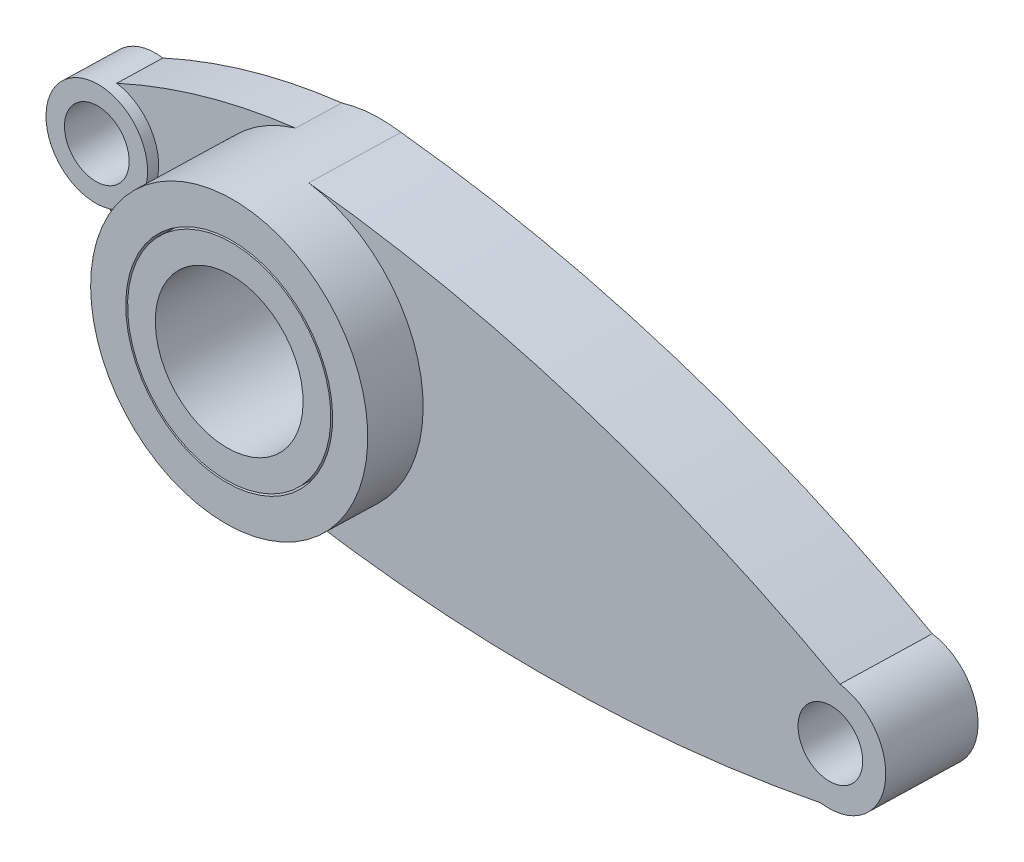
ISO-10303-21;
HEADER;
FILE_DESCRIPTION(('STEP AP214'),'2;1');
FILE_NAME('part.step','',(''),(''),'','','');
FILE_SCHEMA(('AUTOMOTIVE_DESIGN { 1 0 10303 214 1 1 1 1 }'));
ENDSEC;
DATA;
#1=APPLICATION_CONTEXT('core data for automotive mechanical design processes');
#2=APPLICATION_PROTOCOL_DEFINITION('international standard','automotive_design',2000,#1);
#3=PRODUCT_CONTEXT('',#1,'mechanical');
#4=PRODUCT('Part','Part','',(#3));
#5=PRODUCT_RELATED_PRODUCT_CATEGORY('part','',(#4));
#6=PRODUCT_DEFINITION_FORMATION('','',#4);
#7=PRODUCT_DEFINITION_CONTEXT('part definition',#1,'design');
#8=PRODUCT_DEFINITION('design','',#6,#7);
#9=PRODUCT_DEFINITION_SHAPE('','',#8);
#10=(LENGTH_UNIT() NAMED_UNIT(*) SI_UNIT(.MILLI.,.METRE.));
#11=(NAMED_UNIT(*) PLANE_ANGLE_UNIT() SI_UNIT($,.RADIAN.));
#12=(NAMED_UNIT(*) SI_UNIT($,.STERADIAN.) SOLID_ANGLE_UNIT());
#13=UNCERTAINTY_MEASURE_WITH_UNIT(LENGTH_MEASURE(1.E-05),#10,'distance_accuracy_value','');
#14=(GEOMETRIC_REPRESENTATION_CONTEXT(3) GLOBAL_UNCERTAINTY_ASSIGNED_CONTEXT((#13)) GLOBAL_UNIT_ASSIGNED_CONTEXT((#10,
#11,#12)) REPRESENTATION_CONTEXT('',''));
#15=CARTESIAN_POINT('',(0.,0.,0.));
#16=DIRECTION('',(0.,0.,1.));
#17=DIRECTION('',(1.,0.,0.));
#18=AXIS2_PLACEMENT_3D('',#15,#16,#17);
#19=CARTESIAN_POINT('',(51.1215092284812,-180.678580776699,19.727572992126));
#20=DIRECTION('',(0.,0.0265693446490875,0.999646972648303));
#21=DIRECTION('',(0.091674938297919,-0.995437445778039,0.0264574607807962));
#22=AXIS2_PLACEMENT_3D('',#19,#20,#21);
#23=PLANE('',#22);
#24=CARTESIAN_POINT('',(51.1215092284812,-180.678580776699,19.727572992126));
#25=DIRECTION('',(0.,0.0265693446490875,0.999646972648303));
#26=DIRECTION('',(0.091674938297919,-0.995437445778039,0.0264574607807962));
#27=AXIS2_PLACEMENT_3D('',#24,#25,#26);
#28=CIRCLE('',#27,11.);
#29=CARTESIAN_POINT('',(52.1299335497583,-191.628392680258,20.0186050607147));
#30=VERTEX_POINT('',#29);
#31=EDGE_CURVE('P0_E9',#30,#30,#28,.T.);
#32=ORIENTED_EDGE('',*,*,#31,.T.);
#33=EDGE_LOOP('',(#32));
#34=FACE_BOUND('',#33,.T.);
#35=CARTESIAN_POINT('',(51.1215092284812,-180.678580776699,19.727572992126));
#36=DIRECTION('',(0.,0.0265693446490875,0.999646972648303));
#37=DIRECTION('',(0.091674938297919,-0.995437445778039,0.0264574607807962));
#38=AXIS2_PLACEMENT_3D('',#35,#36,#37);
#39=CIRCLE('',#38,8.);
#40=CARTESIAN_POINT('',(51.8549087348646,-188.642080342924,19.9392326783723));
#41=VERTEX_POINT('',#40);
#42=EDGE_CURVE('P0_E25',#41,#41,#39,.T.);
#43=ORIENTED_EDGE('',*,*,#42,.F.);
#44=EDGE_LOOP('',(#43));
#45=FACE_BOUND('',#44,.T.);
#46=ADVANCED_FACE('P0_F14',(#34,#45),#23,.T.);
#47=CARTESIAN_POINT('',(51.1215092284812,-181.103690291085,3.73322142975311));
#48=DIRECTION('',(0.,0.0265693446490875,0.999646972648303));
#49=DIRECTION('',(0.091674938297919,-0.995437445778039,0.0264574607807962));
#50=AXIS2_PLACEMENT_3D('',#47,#48,#49);
#51=PLANE('',#50);
#52=CARTESIAN_POINT('',(51.1215092284812,-181.103690291085,3.73322142975311));
#53=DIRECTION('',(0.,0.0265693446490875,0.999646972648303));
#54=DIRECTION('',(0.091674938297919,-0.995437445778039,0.0264574607807962));
#55=AXIS2_PLACEMENT_3D('',#52,#53,#54);
#56=CIRCLE('',#55,11.);
#57=CARTESIAN_POINT('',(52.1299335497583,-192.053502194643,4.02425349834187));
#58=VERTEX_POINT('',#57);
#59=EDGE_CURVE('P0_E18',#58,#58,#56,.T.);
#60=ORIENTED_EDGE('',*,*,#59,.F.);
#61=EDGE_LOOP('',(#60));
#62=FACE_BOUND('',#61,.T.);
#63=CARTESIAN_POINT('',(51.1215092284812,-181.103690291085,3.73322142975311));
#64=DIRECTION('',(0.,0.0265693446490875,0.999646972648303));
#65=DIRECTION('',(0.091674938297919,-0.995437445778039,0.0264574607807962));
#66=AXIS2_PLACEMENT_3D('',#63,#64,#65);
#67=CIRCLE('',#66,8.);
#68=CARTESIAN_POINT('',(51.8549087348646,-189.067189857309,3.94488111599948));
#69=VERTEX_POINT('',#68);
#70=EDGE_CURVE('P0_E27',#69,#69,#67,.T.);
#71=ORIENTED_EDGE('',*,*,#70,.T.);
#72=EDGE_LOOP('',(#71));
#73=FACE_BOUND('',#72,.T.);
#74=ADVANCED_FACE('P0_F37',(#62,#73),#51,.F.);
#75=CARTESIAN_POINT('',(51.1215092284812,-180.678580776699,19.727572992126));
#76=DIRECTION('',(0.,-0.0265693446490875,-0.999646972648303));
#77=DIRECTION('',(-0.091674938297919,0.995437445778039,-0.0264574607807962));
#78=AXIS2_PLACEMENT_3D('',#75,#76,#77);
#79=CYLINDRICAL_SURFACE('',#78,11.);
#80=ORIENTED_EDGE('',*,*,#31,.F.);
#81=EDGE_LOOP('',(#80));
#82=FACE_BOUND('',#81,.T.);
#83=ORIENTED_EDGE('',*,*,#59,.T.);
#84=EDGE_LOOP('',(#83));
#85=FACE_BOUND('',#84,.T.);
#86=ADVANCED_FACE('P0_F16',(#82,#85),#79,.T.);
#87=CARTESIAN_POINT('',(51.1215092284812,-180.678580776699,19.727572992126));
#88=DIRECTION('',(0.,-0.0265693446490875,-0.999646972648303));
#89=DIRECTION('',(-0.091674938297919,0.995437445778039,-0.0264574607807962));
#90=AXIS2_PLACEMENT_3D('',#87,#88,#89);
#91=CYLINDRICAL_SURFACE('',#90,8.);
#92=ORIENTED_EDGE('',*,*,#42,.T.);
#93=EDGE_LOOP('',(#92));
#94=FACE_BOUND('',#93,.T.);
#95=ORIENTED_EDGE('',*,*,#70,.F.);
#96=EDGE_LOOP('',(#95));
#97=FACE_BOUND('',#96,.T.);
#98=ADVANCED_FACE('P0_F33',(#94,#97),#91,.F.);
#99=CLOSED_SHELL('',(#46,#74,#86,#98));
#100=MANIFOLD_SOLID_BREP('P0_B1',#99);
#101=CARTESIAN_POINT('',(51.1215092284812,-180.970843567839,8.73145629299463));
#102=DIRECTION('',(0.,-0.0265693446490876,-0.999646972648303));
#103=DIRECTION('',(-0.148077804805901,-0.988626578948365,0.0262764366061546));
#104=AXIS2_PLACEMENT_3D('',#101,#102,#103);
#105=PLANE('',#104);
#106=CARTESIAN_POINT('',(26.891604225051,-177.344218100219,8.63506520234079));
#107=DIRECTION('',(0.,0.0265693446490876,0.999646972648303));
#108=DIRECTION('',(0.148077804805901,0.988626578948365,-0.0262764366061546));
#109=AXIS2_PLACEMENT_3D('',#106,#107,#108);
#110=CIRCLE('',#109,5.5);
#111=CARTESIAN_POINT('',(26.0771762986186,-182.781664284435,8.77958560367464));
#112=VERTEX_POINT('',#111);
#113=CARTESIAN_POINT('',(27.7060321514835,-171.906771916003,8.49054480100694));
#114=VERTEX_POINT('',#113);
#115=EDGE_CURVE('P1_E98',#112,#114,#110,.T.);
#116=ORIENTED_EDGE('',*,*,#115,.F.);
#117=CARTESIAN_POINT('',(69.0380692364422,-134.020183431031,7.48356748343595));
#118=DIRECTION('',(0.,-0.0265693446490876,-0.999646972648303));
#119=DIRECTION('',(-0.148077804805901,-0.988626578948365,0.0262764366061546));
#120=AXIS2_PLACEMENT_3D('',#117,#118,#119);
#121=CIRCLE('',#120,65.);
#122=CARTESIAN_POINT('',(42.8981869402038,-193.511412670017,9.06476866394968));
#123=VERTEX_POINT('',#122);
#124=EDGE_CURVE('P1_E81',#112,#123,#121,.F.);
#125=ORIENTED_EDGE('',*,*,#124,.T.);
#126=CARTESIAN_POINT('',(51.1215092284812,-180.970843567839,8.73145629299463));
#127=DIRECTION('',(0.,-0.0265693446490876,-0.999646972648303));
#128=DIRECTION('',(-0.148077804805901,-0.988626578948365,0.0262764366061546));
#129=AXIS2_PLACEMENT_3D('',#126,#127,#128);
#130=CIRCLE('',#129,15.);
#131=CARTESIAN_POINT('',(46.9331263784612,-166.572545104165,8.34876783926149));
#132=VERTEX_POINT('',#131);
#133=EDGE_CURVE('P1_E103',#123,#132,#130,.T.);
#134=ORIENTED_EDGE('',*,*,#133,.T.);
#135=CARTESIAN_POINT('',(54.4960867992781,-231.108267407056,10.0640452271385));
#136=DIRECTION('',(0.,-0.0265693446490876,-0.999646972648303));
#137=DIRECTION('',(-0.148077804805901,-0.988626578948365,0.0262764366061546));
#138=AXIS2_PLACEMENT_3D('',#135,#136,#137);
#139=CIRCLE('',#138,65.);
#140=EDGE_CURVE('P1_E91',#114,#132,#139,.T.);
#141=ORIENTED_EDGE('',*,*,#140,.F.);
#142=EDGE_LOOP('',(#116,#125,#134,#141));
#143=FACE_BOUND('',#142,.T.);
#144=ADVANCED_FACE('P1_F17',(#143),#105,.F.);
#145=CARTESIAN_POINT('',(51.1215092284812,-180.678580776699,19.727572992126));
#146=DIRECTION('',(0.,0.0265693446490876,0.999646972648303));
#147=DIRECTION('',(0.148077804805901,0.988626578948365,-0.0262764366061546));
#148=AXIS2_PLACEMENT_3D('',#145,#146,#147);
#149=PLANE('',#148);
#150=CARTESIAN_POINT('',(51.1215092284812,-180.678580776699,19.727572992126));
#151=DIRECTION('',(0.,0.0265693446490876,0.999646972648303));
#152=DIRECTION('',(0.148077804805901,0.988626578948365,-0.0262764366061546));
#153=AXIS2_PLACEMENT_3D('',#150,#151,#152);
#154=CIRCLE('',#153,15.);
#155=CARTESIAN_POINT('',(53.3426763005697,-165.849182092474,19.3334264430336));
#156=VERTEX_POINT('',#155);
#157=EDGE_CURVE('P1_E11',#156,#156,#154,.T.);
#158=ORIENTED_EDGE('',*,*,#157,.T.);
#159=EDGE_LOOP('',(#158));
#160=FACE_BOUND('',#159,.T.);
#161=CARTESIAN_POINT('',(51.1215092284812,-180.678580776699,19.727572992126));
#162=DIRECTION('',(0.,0.0265693446490876,0.999646972648303));
#163=DIRECTION('',(0.148077804805901,0.988626578948365,-0.0262764366061546));
#164=AXIS2_PLACEMENT_3D('',#161,#162,#163);
#165=CIRCLE('',#164,11.2);
#166=CARTESIAN_POINT('',(49.4630378146551,-191.751198460921,20.0218690821149));
#167=VERTEX_POINT('',#166);
#168=EDGE_CURVE('P1_E162',#167,#167,#165,.T.);
#169=ORIENTED_EDGE('',*,*,#168,.F.);
#170=EDGE_LOOP('',(#169));
#171=FACE_BOUND('',#170,.T.);
#172=ADVANCED_FACE('P1_F187',(#160,#171),#149,.T.);
#173=CARTESIAN_POINT('',(51.1215092284812,-181.103690291085,3.73322142975311));
#174=DIRECTION('',(0.,0.0265693446490876,0.999646972648303));
#175=DIRECTION('',(0.148077804805901,0.988626578948365,-0.0262764366061546));
#176=AXIS2_PLACEMENT_3D('',#173,#174,#175);
#177=PLANE('',#176);
#178=CARTESIAN_POINT('',(51.1215092284812,-181.103690291085,3.73322142975311));
#179=DIRECTION('',(0.,0.0265693446490876,0.999646972648303));
#180=DIRECTION('',(0.148077804805901,0.988626578948365,-0.0262764366061546));
#181=AXIS2_PLACEMENT_3D('',#178,#179,#180);
#182=CIRCLE('',#181,15.);
#183=CARTESIAN_POINT('',(42.8981869402038,-193.644259393262,4.06653380070816));
#184=VERTEX_POINT('',#183);
#185=CARTESIAN_POINT('',(48.9003421563932,-195.93308897531,4.12736797884543));
#186=VERTEX_POINT('',#185);
#187=EDGE_CURVE('P1_E21',#184,#186,#182,.T.);
#188=ORIENTED_EDGE('',*,*,#187,.F.);
#189=CARTESIAN_POINT('',(69.0380692364422,-134.153030154276,2.48533262019443));
#190=DIRECTION('',(0.,-0.0265693446490876,-0.999646972648303));
#191=DIRECTION('',(-0.148077804805901,-0.988626578948365,0.0262764366061546));
#192=AXIS2_PLACEMENT_3D('',#189,#190,#191);
#193=CIRCLE('',#192,65.);
#194=CARTESIAN_POINT('',(26.0771762986186,-182.91451100768,3.78135074043312));
#195=VERTEX_POINT('',#194);
#196=EDGE_CURVE('P1_E142',#195,#184,#193,.F.);
#197=ORIENTED_EDGE('',*,*,#196,.F.);
#198=CARTESIAN_POINT('',(26.891604225051,-177.477064823464,3.63683033909927));
#199=DIRECTION('',(0.,-0.0265693446490876,-0.999646972648303));
#200=DIRECTION('',(-0.148077804805901,-0.988626578948365,0.0262764366061546));
#201=AXIS2_PLACEMENT_3D('',#198,#199,#200);
#202=CIRCLE('',#201,5.5);
#203=CARTESIAN_POINT('',(27.7060321514835,-172.039618639248,3.49230993776542));
#204=VERTEX_POINT('',#203);
#205=EDGE_CURVE('P1_E100',#204,#195,#202,.F.);
#206=ORIENTED_EDGE('',*,*,#205,.F.);
#207=CARTESIAN_POINT('',(54.4960867992781,-231.241114130301,5.06581036389696));
#208=DIRECTION('',(0.,-0.0265693446490876,-0.999646972648303));
#209=DIRECTION('',(-0.148077804805901,-0.988626578948365,0.0262764366061546));
#210=AXIS2_PLACEMENT_3D('',#207,#208,#209);
#211=CIRCLE('',#210,65.);
#212=CARTESIAN_POINT('',(46.9331263784612,-166.705391827411,3.35053297601998));
#213=VERTEX_POINT('',#212);
#214=EDGE_CURVE('P1_E151',#204,#213,#211,.T.);
#215=ORIENTED_EDGE('',*,*,#214,.T.);
#216=CARTESIAN_POINT('',(53.3426763005697,-166.274291606859,3.33907488066079));
#217=VERTEX_POINT('',#216);
#218=EDGE_CURVE('P1_E165',#217,#213,#182,.T.);
#219=ORIENTED_EDGE('',*,*,#218,.F.);
#220=CARTESIAN_POINT('',(36.2931920709823,-325.307145070554,7.56596578296669));
#221=DIRECTION('',(0.,-0.0265693446490876,-0.999646972648303));
#222=DIRECTION('',(-0.148077804805901,-0.988626578948365,0.0262764366061546));
#223=AXIS2_PLACEMENT_3D('',#220,#221,#222);
#224=CIRCLE('',#223,160.);
#225=CARTESIAN_POINT('',(111.34851892286,-184.053462574832,3.81162262396231));
#226=VERTEX_POINT('',#225);
#227=EDGE_CURVE('P1_E135',#217,#226,#224,.T.);
#228=ORIENTED_EDGE('',*,*,#227,.T.);
#229=CARTESIAN_POINT('',(110.460052094024,-189.985222048522,3.96928124359924));
#230=DIRECTION('',(0.,-0.0265693446490876,-0.999646972648303));
#231=DIRECTION('',(-0.148077804805901,-0.988626578948365,0.0262764366061546));
#232=AXIS2_PLACEMENT_3D('',#229,#230,#231);
#233=CIRCLE('',#232,6.);
#234=CARTESIAN_POINT('',(109.571585265189,-195.916981522212,4.12693986323617));
#235=VERTEX_POINT('',#234);
#236=EDGE_CURVE('P1_E111',#226,#235,#233,.T.);
#237=ORIENTED_EDGE('',*,*,#236,.T.);
#238=CARTESIAN_POINT('',(79.1942414638075,-38.8826012294414,-0.0468341649101115));
#239=DIRECTION('',(0.,-0.0265693446490876,-0.999646972648303));
#240=DIRECTION('',(-0.148077804805901,-0.988626578948365,0.0262764366061546));
#241=AXIS2_PLACEMENT_3D('',#238,#239,#240);
#242=CIRCLE('',#241,160.);
#243=EDGE_CURVE('P1_E132',#186,#235,#242,.F.);
#244=ORIENTED_EDGE('',*,*,#243,.F.);
#245=EDGE_LOOP('',(#188,#197,#206,#215,#219,#228,#237,#244));
#246=FACE_BOUND('',#245,.T.);
#247=CARTESIAN_POINT('',(51.1215092284812,-181.103690291085,3.73322142975311));
#248=DIRECTION('',(0.,0.0265693446490876,0.999646972648303));
#249=DIRECTION('',(0.148077804805901,0.988626578948365,-0.0262764366061546));
#250=AXIS2_PLACEMENT_3D('',#247,#248,#249);
#251=CIRCLE('',#250,11.2);
#252=CARTESIAN_POINT('',(49.4630378146551,-192.176307975306,4.02751751974204));
#253=VERTEX_POINT('',#252);
#254=EDGE_CURVE('P1_E157',#253,#253,#251,.T.);
#255=ORIENTED_EDGE('',*,*,#254,.T.);
#256=EDGE_LOOP('',(#255));
#257=FACE_BOUND('',#256,.T.);
#258=CARTESIAN_POINT('',(26.891604225051,-177.477064823464,3.63683033909927));
#259=DIRECTION('',(0.,-0.0265693446490876,-0.999646972648303));
#260=DIRECTION('',(-0.148077804805901,-0.988626578948365,0.0262764366061546));
#261=AXIS2_PLACEMENT_3D('',#258,#259,#260);
#262=CIRCLE('',#261,3.5);
#263=CARTESIAN_POINT('',(26.3733319082304,-180.937257849784,3.72879786722081));
#264=VERTEX_POINT('',#263);
#265=EDGE_CURVE('P1_E92',#264,#264,#262,.F.);
#266=ORIENTED_EDGE('',*,*,#265,.T.);
#267=EDGE_LOOP('',(#266));
#268=FACE_BOUND('',#267,.T.);
#269=CARTESIAN_POINT('',(110.460052094024,-189.985222048522,3.96928124359924));
#270=DIRECTION('',(0.,-0.0265693446490876,-0.999646972648303));
#271=DIRECTION('',(-0.148077804805901,-0.988626578948365,0.0262764366061546));
#272=AXIS2_PLACEMENT_3D('',#269,#270,#271);
#273=CIRCLE('',#272,3.5);
#274=CARTESIAN_POINT('',(109.941779777204,-193.445415074842,4.06124877172078));
#275=VERTEX_POINT('',#274);
#276=EDGE_CURVE('P1_E120',#275,#275,#273,.T.);
#277=ORIENTED_EDGE('',*,*,#276,.F.);
#278=EDGE_LOOP('',(#277));
#279=FACE_BOUND('',#278,.T.);
#280=ADVANCED_FACE('P1_F169',(#246,#257,#268,#279),#177,.F.);
#281=CARTESIAN_POINT('',(51.1215092284812,-180.678580776699,19.727572992126));
#282=DIRECTION('',(0.,-0.0265693446490876,-0.999646972648303));
#283=DIRECTION('',(-0.148077804805901,-0.988626578948365,0.0262764366061546));
#284=AXIS2_PLACEMENT_3D('',#281,#282,#283);
#285=CYLINDRICAL_SURFACE('',#284,15.);
#286=CARTESIAN_POINT('',(51.1215092284812,-180.837996844594,13.7296911562361));
#287=DIRECTION('',(0.,-0.0265693446490876,-0.999646972648303));
#288=DIRECTION('',(-0.148077804805901,-0.988626578948365,0.0262764366061546));
#289=AXIS2_PLACEMENT_3D('',#286,#287,#288);
#290=CIRCLE('',#289,15.);
#291=CARTESIAN_POINT('',(53.3426763005703,-166.008598160368,13.3355446071438));
#292=VERTEX_POINT('',#291);
#293=CARTESIAN_POINT('',(48.9003421563927,-195.667395528819,14.1238377053285));
#294=VERTEX_POINT('',#293);
#295=EDGE_CURVE('P1_E36',#292,#294,#290,.T.);
#296=ORIENTED_EDGE('',*,*,#295,.F.);
#297=DIRECTION('',(0.,-0.0265693446490876,-0.999646972648303));
#298=VECTOR('',#297,1.);
#299=CARTESIAN_POINT('',(53.3426763005697,-166.008598160368,13.3355446071438));
#300=LINE('',#299,#298);
#301=EDGE_CURVE('P1_E143',#292,#217,#300,.T.);
#302=ORIENTED_EDGE('',*,*,#301,.T.);
#303=ORIENTED_EDGE('',*,*,#218,.T.);
#304=DIRECTION('',(0.,-0.0265693446490876,-0.999646972648303));
#305=VECTOR('',#304,1.);
#306=CARTESIAN_POINT('',(46.9331263784612,-166.572545104165,8.34876783926149));
#307=LINE('',#306,#305);
#308=EDGE_CURVE('P1_E158',#132,#213,#307,.T.);
#309=ORIENTED_EDGE('',*,*,#308,.F.);
#310=ORIENTED_EDGE('',*,*,#133,.F.);
#311=DIRECTION('',(0.,-0.0265693446490876,-0.999646972648303));
#312=VECTOR('',#311,1.);
#313=CARTESIAN_POINT('',(42.8981869402038,-193.511412670017,9.06476866394968));
#314=LINE('',#313,#312);
#315=EDGE_CURVE('P1_E87',#123,#184,#314,.T.);
#316=ORIENTED_EDGE('',*,*,#315,.T.);
#317=ORIENTED_EDGE('',*,*,#187,.T.);
#318=DIRECTION('',(0.,-0.0265693446490876,-0.999646972648303));
#319=VECTOR('',#318,1.);
#320=CARTESIAN_POINT('',(48.9003421563927,-195.667395528819,14.1238377053285));
#321=LINE('',#320,#319);
#322=EDGE_CURVE('P1_E32',#294,#186,#321,.T.);
#323=ORIENTED_EDGE('',*,*,#322,.F.);
#324=EDGE_LOOP('',(#296,#302,#303,#309,#310,#316,#317,#323));
#325=FACE_BOUND('',#324,.T.);
#326=ORIENTED_EDGE('',*,*,#157,.F.);
#327=EDGE_LOOP('',(#326));
#328=FACE_BOUND('',#327,.T.);
#329=ADVANCED_FACE('P1_F19',(#325,#328),#285,.T.);
#330=CARTESIAN_POINT('',(51.1215092284812,-180.678580776699,19.727572992126));
#331=DIRECTION('',(0.,-0.0265693446490876,-0.999646972648303));
#332=DIRECTION('',(-0.148077804805901,-0.988626578948365,0.0262764366061546));
#333=AXIS2_PLACEMENT_3D('',#330,#331,#332);
#334=CYLINDRICAL_SURFACE('',#333,11.2);
#335=CARTESIAN_POINT('',(49.4630378146551,-191.751198460921,20.0218690821149));
#336=CARTESIAN_POINT('',(49.4630378146551,-191.755626685029,19.8552612533402));
#337=CARTESIAN_POINT('',(49.4630378146551,-191.760054909137,19.6886534245655));
#338=CARTESIAN_POINT('',(49.4630378146551,-191.768911357354,19.355437767016));
#339=CARTESIAN_POINT('',(49.4630378146551,-191.773339581462,19.1888299382413));
#340=CARTESIAN_POINT('',(49.4630378146551,-191.782196029678,18.8556142806919));
#341=CARTESIAN_POINT('',(49.4630378146551,-191.786624253786,18.6890064519172));
#342=CARTESIAN_POINT('',(49.4630378146551,-191.795480702003,18.3557907943677));
#343=CARTESIAN_POINT('',(49.4630378146551,-191.799908926111,18.189182965593));
#344=CARTESIAN_POINT('',(49.4630378146551,-191.808765374327,17.8559673080436));
#345=CARTESIAN_POINT('',(49.4630378146551,-191.813193598436,17.6893594792689));
#346=CARTESIAN_POINT('',(49.4630378146551,-191.822050046652,17.3561438217194));
#347=CARTESIAN_POINT('',(49.4630378146551,-191.82647827076,17.1895359929447));
#348=CARTESIAN_POINT('',(49.4630378146551,-191.835334718976,16.8563203353953));
#349=CARTESIAN_POINT('',(49.4630378146551,-191.839762943085,16.6897125066205));
#350=CARTESIAN_POINT('',(49.4630378146551,-191.848619391301,16.3564968490711));
#351=CARTESIAN_POINT('',(49.4630378146551,-191.853047615409,16.1898890202964));
#352=CARTESIAN_POINT('',(49.4630378146551,-191.861904063626,15.856673362747));
#353=CARTESIAN_POINT('',(49.4630378146551,-191.866332287734,15.6900655339722));
#354=CARTESIAN_POINT('',(49.4630378146551,-191.87518873595,15.3568498764228));
#355=CARTESIAN_POINT('',(49.4630378146551,-191.879616960058,15.1902420476481));
#356=CARTESIAN_POINT('',(49.4630378146551,-191.888473408275,14.8570263900987));
#357=CARTESIAN_POINT('',(49.4630378146551,-191.892901632383,14.6904185613239));
#358=CARTESIAN_POINT('',(49.4630378146551,-191.901758080599,14.3572029037745));
#359=CARTESIAN_POINT('',(49.4630378146551,-191.906186304707,14.1905950749998));
#360=CARTESIAN_POINT('',(49.4630378146551,-191.915042752924,13.8573794174504));
#361=CARTESIAN_POINT('',(49.4630378146551,-191.919470977032,13.6907715886756));
#362=CARTESIAN_POINT('',(49.4630378146551,-191.928327425248,13.3575559311262));
#363=CARTESIAN_POINT('',(49.4630378146551,-191.932755649356,13.1909481023515));
#364=CARTESIAN_POINT('',(49.4630378146551,-191.941612097573,12.8577324448021));
#365=CARTESIAN_POINT('',(49.4630378146551,-191.946040321681,12.6911246160273));
#366=CARTESIAN_POINT('',(49.4630378146551,-191.954896769897,12.3579089584779));
#367=CARTESIAN_POINT('',(49.4630378146551,-191.959324994005,12.1913011297032));
#368=CARTESIAN_POINT('',(49.4630378146551,-191.968181442222,11.8580854721538));
#369=CARTESIAN_POINT('',(49.4630378146551,-191.97260966633,11.691477643379));
#370=CARTESIAN_POINT('',(49.4630378146551,-191.981466114546,11.3582619858296));
#371=CARTESIAN_POINT('',(49.4630378146551,-191.985894338655,11.1916541570549));
#372=CARTESIAN_POINT('',(49.4630378146551,-191.994750786871,10.8584384995054));
#373=CARTESIAN_POINT('',(49.4630378146551,-191.999179010979,10.6918306707307));
#374=CARTESIAN_POINT('',(49.4630378146551,-192.008035459195,10.3586150131813));
#375=CARTESIAN_POINT('',(49.4630378146551,-192.012463683304,10.1920071844066));
#376=CARTESIAN_POINT('',(49.4630378146551,-192.02132013152,9.85879152685715));
#377=CARTESIAN_POINT('',(49.4630378146551,-192.025748355628,9.69218369808243));
#378=CARTESIAN_POINT('',(49.4630378146551,-192.034604803845,9.358968040533));
#379=CARTESIAN_POINT('',(49.4630378146551,-192.039033027953,9.19236021175828));
#380=CARTESIAN_POINT('',(49.4630378146551,-192.047889476169,8.85914455420884));
#381=CARTESIAN_POINT('',(49.4630378146551,-192.052317700277,8.69253672543413));
#382=CARTESIAN_POINT('',(49.4630378146551,-192.061174148494,8.35932106788469));
#383=CARTESIAN_POINT('',(49.4630378146551,-192.065602372602,8.19271323910997));
#384=CARTESIAN_POINT('',(49.4630378146551,-192.074458820818,7.85949758156054));
#385=CARTESIAN_POINT('',(49.4630378146551,-192.078887044926,7.69288975278582));
#386=CARTESIAN_POINT('',(49.4630378146551,-192.087743493143,7.35967409523639));
#387=CARTESIAN_POINT('',(49.4630378146551,-192.092171717251,7.19306626646167));
#388=CARTESIAN_POINT('',(49.4630378146551,-192.101028165467,6.85985060891224));
#389=CARTESIAN_POINT('',(49.4630378146551,-192.105456389575,6.69324278013752));
#390=CARTESIAN_POINT('',(49.4630378146551,-192.114312837792,6.36002712258809));
#391=CARTESIAN_POINT('',(49.4630378146551,-192.1187410619,6.19341929381337));
#392=CARTESIAN_POINT('',(49.4630378146551,-192.127597510116,5.86020363626393));
#393=CARTESIAN_POINT('',(49.4630378146551,-192.132025734225,5.69359580748922));
#394=CARTESIAN_POINT('',(49.4630378146551,-192.140882182441,5.36038014993978));
#395=CARTESIAN_POINT('',(49.4630378146551,-192.145310406549,5.19377232116507));
#396=CARTESIAN_POINT('',(49.4630378146551,-192.154166854765,4.86055666361563));
#397=CARTESIAN_POINT('',(49.4630378146551,-192.158595078874,4.69394883484091));
#398=CARTESIAN_POINT('',(49.4630378146551,-192.16745152709,4.36073317729148));
#399=CARTESIAN_POINT('',(49.4630378146551,-192.171879751198,4.19412534851676));
#400=CARTESIAN_POINT('',(49.4630378146551,-192.176307975306,4.02751751974204));
#401=B_SPLINE_CURVE_WITH_KNOTS('',3,(#335,#336,#337,#338,#339,#340,#341,#342,#343,#344,#345,
#346,#347,#348,#349,#350,#351,#352,#353,#354,#355,#356,#357,#358,#359,#360,#361,#362,#363,#364,
#365,#366,#367,#368,#369,#370,#371,#372,#373,#374,#375,#376,#377,#378,#379,#380,#381,#382,#383,
#384,#385,#386,#387,#388,#389,#390,#391,#392,#393,#394,#395,#396,#397,#398,#399,#400),
.UNSPECIFIED.,.F.,.F.,(4,2,2,2,2,2,2,2,2,2,2,2,2,2,2,2,2,2,2,2,2,2,2,2,2,2,2,2,2,2,2,2,4),(0.,
0.499999999999999,0.999999999999999,1.5,2.,2.5,3.,3.5,4.,4.5,5.,5.5,5.99999999999999,6.5,
6.99999999999999,7.5,7.99999999999999,8.49999999999999,8.99999999999999,9.49999999999999,
9.99999999999999,10.5,11.,11.5,12.,12.5,13.,13.5,14.,14.5,15.,15.5,16.),.UNSPECIFIED.);
#402=EDGE_CURVE('P1_BSEAM172',#167,#253,#401,.T.);
#403=ORIENTED_EDGE('',*,*,#168,.T.);
#404=ORIENTED_EDGE('',*,*,#254,.F.);
#405=ORIENTED_EDGE('',*,*,#402,.T.);
#406=ORIENTED_EDGE('',*,*,#402,.F.);
#407=EDGE_LOOP('',(#403,#405,#404,#406));
#408=FACE_BOUND('',#407,.T.);
#409=ADVANCED_FACE('P1_F172',(#408),#334,.F.);
#410=CARTESIAN_POINT('',(26.891604225051,-177.344218100219,8.63506520234079));
#411=DIRECTION('',(0.,-0.0265693446490876,-0.999646972648303));
#412=DIRECTION('',(-0.148077804805901,-0.988626578948365,0.0262764366061546));
#413=AXIS2_PLACEMENT_3D('',#410,#411,#412);
#414=CYLINDRICAL_SURFACE('',#413,3.5);
#415=CARTESIAN_POINT('',(26.891604225051,-177.31233488664,9.83464156951875));
#416=DIRECTION('',(0.,0.0265693446490876,0.999646972648303));
#417=DIRECTION('',(0.148077804805901,0.988626578948365,-0.0262764366061546));
#418=AXIS2_PLACEMENT_3D('',#415,#416,#417);
#419=CIRCLE('',#418,3.5);
#420=CARTESIAN_POINT('',(26.3733319082304,-180.772527912959,9.92660909764029));
#421=VERTEX_POINT('',#420);
#422=EDGE_CURVE('P1_E108',#421,#421,#419,.T.);
#423=CARTESIAN_POINT('',(26.3733319082304,-180.937257849784,3.72879786722081));
#424=CARTESIAN_POINT('',(26.3733319082304,-180.935541912942,3.79335840087102));
#425=CARTESIAN_POINT('',(26.3733319082304,-180.9338259761,3.85791893452122));
#426=CARTESIAN_POINT('',(26.3733319082304,-180.930394102416,3.98704000182163));
#427=CARTESIAN_POINT('',(26.3733319082304,-180.928678165574,4.05160053547183));
#428=CARTESIAN_POINT('',(26.3733319082304,-180.92524629189,4.18072160277223));
#429=CARTESIAN_POINT('',(26.3733319082304,-180.923530355048,4.24528213642244));
#430=CARTESIAN_POINT('',(26.3733319082304,-180.920098481364,4.37440320372284));
#431=CARTESIAN_POINT('',(26.3733319082304,-180.918382544523,4.43896373737305));
#432=CARTESIAN_POINT('',(26.3733319082304,-180.914950670839,4.56808480467345));
#433=CARTESIAN_POINT('',(26.3733319082304,-180.913234733997,4.63264533832366));
#434=CARTESIAN_POINT('',(26.3733319082304,-180.909802860313,4.76176640562406));
#435=CARTESIAN_POINT('',(26.3733319082304,-180.908086923471,4.82632693927426));
#436=CARTESIAN_POINT('',(26.3733319082304,-180.904655049787,4.95544800657467));
#437=CARTESIAN_POINT('',(26.3733319082304,-180.902939112945,5.02000854022487));
#438=CARTESIAN_POINT('',(26.3733319082304,-180.899507239261,5.14912960752528));
#439=CARTESIAN_POINT('',(26.3733319082304,-180.89779130242,5.21369014117548));
#440=CARTESIAN_POINT('',(26.3733319082304,-180.894359428736,5.34281120847589));
#441=CARTESIAN_POINT('',(26.3733319082304,-180.892643491894,5.40737174212609));
#442=CARTESIAN_POINT('',(26.3733319082304,-180.88921161821,5.5364928094265));
#443=CARTESIAN_POINT('',(26.3733319082304,-180.887495681368,5.6010533430767));
#444=CARTESIAN_POINT('',(26.3733319082304,-180.884063807684,5.7301744103771));
#445=CARTESIAN_POINT('',(26.3733319082304,-180.882347870842,5.79473494402731));
#446=CARTESIAN_POINT('',(26.3733319082304,-180.878915997158,5.92385601132771));
#447=CARTESIAN_POINT('',(26.3733319082304,-180.877200060316,5.98841654497792));
#448=CARTESIAN_POINT('',(26.3733319082304,-180.873768186633,6.11753761227832));
#449=CARTESIAN_POINT('',(26.3733319082304,-180.872052249791,6.18209814592853));
#450=CARTESIAN_POINT('',(26.3733319082304,-180.868620376107,6.31121921322893));
#451=CARTESIAN_POINT('',(26.3733319082304,-180.866904439265,6.37577974687913));
#452=CARTESIAN_POINT('',(26.3733319082304,-180.863472565581,6.50490081417954));
#453=CARTESIAN_POINT('',(26.3733319082304,-180.861756628739,6.56946134782974));
#454=CARTESIAN_POINT('',(26.3733319082304,-180.858324755055,6.69858241513015));
#455=CARTESIAN_POINT('',(26.3733319082304,-180.856608818213,6.76314294878035));
#456=CARTESIAN_POINT('',(26.3733319082304,-180.85317694453,6.89226401608076));
#457=CARTESIAN_POINT('',(26.3733319082304,-180.851461007688,6.95682454973096));
#458=CARTESIAN_POINT('',(26.3733319082304,-180.848029134004,7.08594561703137));
#459=CARTESIAN_POINT('',(26.3733319082304,-180.846313197162,7.15050615068157));
#460=CARTESIAN_POINT('',(26.3733319082304,-180.842881323478,7.27962721798198));
#461=CARTESIAN_POINT('',(26.3733319082304,-180.841165386636,7.34418775163218));
#462=CARTESIAN_POINT('',(26.3733319082304,-180.837733512952,7.47330881893258));
#463=CARTESIAN_POINT('',(26.3733319082304,-180.83601757611,7.53786935258279));
#464=CARTESIAN_POINT('',(26.3733319082304,-180.832585702427,7.66699041988319));
#465=CARTESIAN_POINT('',(26.3733319082304,-180.830869765585,7.73155095353339));
#466=CARTESIAN_POINT('',(26.3733319082304,-180.827437891901,7.8606720208338));
#467=CARTESIAN_POINT('',(26.3733319082304,-180.825721955059,7.925232554484));
#468=CARTESIAN_POINT('',(26.3733319082304,-180.822290081375,8.05435362178441));
#469=CARTESIAN_POINT('',(26.3733319082304,-180.820574144533,8.11891415543461));
#470=CARTESIAN_POINT('',(26.3733319082304,-180.817142270849,8.24803522273502));
#471=CARTESIAN_POINT('',(26.3733319082304,-180.815426334007,8.31259575638522));
#472=CARTESIAN_POINT('',(26.3733319082304,-180.811994460323,8.44171682368563));
#473=CARTESIAN_POINT('',(26.3733319082304,-180.810278523482,8.50627735733583));
#474=CARTESIAN_POINT('',(26.3733319082304,-180.806846649798,8.63539842463624));
#475=CARTESIAN_POINT('',(26.3733319082304,-180.805130712956,8.69995895828644));
#476=CARTESIAN_POINT('',(26.3733319082304,-180.801698839272,8.82908002558684));
#477=CARTESIAN_POINT('',(26.3733319082304,-180.79998290243,8.89364055923705));
#478=CARTESIAN_POINT('',(26.3733319082304,-180.796551028746,9.02276162653745));
#479=CARTESIAN_POINT('',(26.3733319082304,-180.794835091904,9.08732216018766));
#480=CARTESIAN_POINT('',(26.3733319082304,-180.79140321822,9.21644322748806));
#481=CARTESIAN_POINT('',(26.3733319082304,-180.789687281379,9.28100376113827));
#482=CARTESIAN_POINT('',(26.3733319082304,-180.786255407695,9.41012482843867));
#483=CARTESIAN_POINT('',(26.3733319082304,-180.784539470853,9.47468536208887));
#484=CARTESIAN_POINT('',(26.3733319082304,-180.781107597169,9.60380642938928));
#485=CARTESIAN_POINT('',(26.3733319082304,-180.779391660327,9.66836696303948));
#486=CARTESIAN_POINT('',(26.3733319082304,-180.775959786643,9.79748803033989));
#487=CARTESIAN_POINT('',(26.3733319082304,-180.774243849801,9.86204856399009));
#488=CARTESIAN_POINT('',(26.3733319082304,-180.772527912959,9.92660909764029));
#489=B_SPLINE_CURVE_WITH_KNOTS('',3,(#423,#424,#425,#426,#427,#428,#429,#430,#431,#432,#433,
#434,#435,#436,#437,#438,#439,#440,#441,#442,#443,#444,#445,#446,#447,#448,#449,#450,#451,#452,
#453,#454,#455,#456,#457,#458,#459,#460,#461,#462,#463,#464,#465,#466,#467,#468,#469,#470,#471,
#472,#473,#474,#475,#476,#477,#478,#479,#480,#481,#482,#483,#484,#485,#486,#487,#488),
.UNSPECIFIED.,.F.,.F.,(4,2,2,2,2,2,2,2,2,2,2,2,2,2,2,2,2,2,2,2,2,2,2,2,2,2,2,2,2,2,2,2,4),(0.,
0.19375,0.387499999999999,0.581249999999999,0.775,0.968749999999999,1.1625,1.35625,1.55,1.74375,
1.9375,2.13125,2.325,2.51875,2.7125,2.90625,3.1,3.29375,3.4875,3.68125,3.875,4.06875,4.2625,
4.45625,4.65,4.84375,5.0375,5.23125,5.425,5.61875,5.8125,6.00625,6.2),.UNSPECIFIED.);
#490=EDGE_CURVE('P1_BSEAM174',#264,#421,#489,.T.);
#491=ORIENTED_EDGE('',*,*,#265,.F.);
#492=ORIENTED_EDGE('',*,*,#422,.T.);
#493=ORIENTED_EDGE('',*,*,#490,.T.);
#494=ORIENTED_EDGE('',*,*,#490,.F.);
#495=EDGE_LOOP('',(#491,#493,#492,#494));
#496=FACE_BOUND('',#495,.T.);
#497=ADVANCED_FACE('P1_F174',(#496),#414,.F.);
#498=CARTESIAN_POINT('',(26.891604225051,-177.344218100219,8.63506520234079));
#499=DIRECTION('',(0.,-0.0265693446490876,-0.999646972648303));
#500=DIRECTION('',(-0.148077804805901,-0.988626578948365,0.0262764366061546));
#501=AXIS2_PLACEMENT_3D('',#498,#499,#500);
#502=CYLINDRICAL_SURFACE('',#501,5.5);
#503=ORIENTED_EDGE('',*,*,#205,.T.);
#504=DIRECTION('',(0.,-0.0265693446490876,-0.999646972648303));
#505=VECTOR('',#504,1.);
#506=CARTESIAN_POINT('',(26.0771762986186,-182.781664284435,8.77958560367464));
#507=LINE('',#506,#505);
#508=EDGE_CURVE('P1_E85',#112,#195,#507,.T.);
#509=ORIENTED_EDGE('',*,*,#508,.F.);
#510=ORIENTED_EDGE('',*,*,#115,.T.);
#511=DIRECTION('',(0.,-0.0265693446490876,-0.999646972648303));
#512=VECTOR('',#511,1.);
#513=CARTESIAN_POINT('',(27.7060321514835,-171.906771916003,8.49054480100694));
#514=LINE('',#513,#512);
#515=EDGE_CURVE('P1_E102',#114,#204,#514,.T.);
#516=ORIENTED_EDGE('',*,*,#515,.T.);
#517=EDGE_LOOP('',(#503,#509,#510,#516));
#518=FACE_BOUND('',#517,.T.);
#519=CARTESIAN_POINT('',(26.891604225051,-177.31233488664,9.83464156951875));
#520=DIRECTION('',(0.,0.0265693446490876,0.999646972648303));
#521=DIRECTION('',(0.148077804805901,0.988626578948365,-0.0262764366061546));
#522=AXIS2_PLACEMENT_3D('',#519,#520,#521);
#523=CIRCLE('',#522,5.5);
#524=CARTESIAN_POINT('',(27.7060321514835,-171.874888702424,9.6901211681849));
#525=VERTEX_POINT('',#524);
#526=EDGE_CURVE('P1_E107',#525,#525,#523,.T.);
#527=ORIENTED_EDGE('',*,*,#526,.F.);
#528=EDGE_LOOP('',(#527));
#529=FACE_BOUND('',#528,.T.);
#530=ADVANCED_FACE('P1_F96',(#518,#529),#502,.T.);
#531=CARTESIAN_POINT('',(54.4960867992781,-231.108267407056,10.0640452271385));
#532=DIRECTION('',(0.,-0.0265693446490876,-0.999646972648303));
#533=DIRECTION('',(-0.148077804805901,-0.988626578948365,0.0262764366061546));
#534=AXIS2_PLACEMENT_3D('',#531,#532,#533);
#535=CYLINDRICAL_SURFACE('',#534,65.);
#536=ORIENTED_EDGE('',*,*,#214,.F.);
#537=ORIENTED_EDGE('',*,*,#515,.F.);
#538=ORIENTED_EDGE('',*,*,#140,.T.);
#539=ORIENTED_EDGE('',*,*,#308,.T.);
#540=EDGE_LOOP('',(#536,#537,#538,#539));
#541=FACE_BOUND('',#540,.T.);
#542=ADVANCED_FACE('P1_F197',(#541),#535,.T.);
#543=CARTESIAN_POINT('',(69.0380692364422,-134.020183431031,7.48356748343595));
#544=DIRECTION('',(0.,-0.0265693446490876,-0.999646972648303));
#545=DIRECTION('',(-0.148077804805901,-0.988626578948365,0.0262764366061546));
#546=AXIS2_PLACEMENT_3D('',#543,#544,#545);
#547=CYLINDRICAL_SURFACE('',#546,65.);
#548=ORIENTED_EDGE('',*,*,#196,.T.);
#549=ORIENTED_EDGE('',*,*,#315,.F.);
#550=ORIENTED_EDGE('',*,*,#124,.F.);
#551=ORIENTED_EDGE('',*,*,#508,.T.);
#552=EDGE_LOOP('',(#548,#549,#550,#551));
#553=FACE_BOUND('',#552,.T.);
#554=ADVANCED_FACE('P1_F84',(#553),#547,.T.);
#555=CARTESIAN_POINT('',(110.460052094024,-189.719528602031,13.9657509700823));
#556=DIRECTION('',(0.,-0.0265693446490876,-0.999646972648303));
#557=DIRECTION('',(-0.148077804805901,-0.988626578948365,0.0262764366061546));
#558=AXIS2_PLACEMENT_3D('',#555,#556,#557);
#559=CYLINDRICAL_SURFACE('',#558,6.);
#560=ORIENTED_EDGE('',*,*,#236,.F.);
#561=DIRECTION('',(0.,-0.0265693446490876,-0.999646972648303));
#562=VECTOR('',#561,1.);
#563=CARTESIAN_POINT('',(111.34851892286,-183.787769128341,13.8080923504453));
#564=LINE('',#563,#562);
#565=CARTESIAN_POINT('',(111.34851892286,-183.787769128341,13.8080923504453));
#566=VERTEX_POINT('',#565);
#567=EDGE_CURVE('P1_E140',#566,#226,#564,.T.);
#568=ORIENTED_EDGE('',*,*,#567,.F.);
#569=CARTESIAN_POINT('',(110.460052094024,-189.719528602031,13.9657509700823));
#570=DIRECTION('',(0.,-0.0265693446490876,-0.999646972648303));
#571=DIRECTION('',(-0.148077804805901,-0.988626578948365,0.0262764366061546));
#572=AXIS2_PLACEMENT_3D('',#569,#570,#571);
#573=CIRCLE('',#572,6.);
#574=CARTESIAN_POINT('',(109.571585265189,-195.651288075722,14.1234095897192));
#575=VERTEX_POINT('',#574);
#576=EDGE_CURVE('P1_E116',#566,#575,#573,.T.);
#577=ORIENTED_EDGE('',*,*,#576,.T.);
#578=DIRECTION('',(0.,-0.0265693446490876,-0.999646972648303));
#579=VECTOR('',#578,1.);
#580=CARTESIAN_POINT('',(109.571585265189,-195.651288075722,14.1234095897192));
#581=LINE('',#580,#579);
#582=EDGE_CURVE('P1_E129',#575,#235,#581,.T.);
#583=ORIENTED_EDGE('',*,*,#582,.T.);
#584=EDGE_LOOP('',(#560,#568,#577,#583));
#585=FACE_BOUND('',#584,.T.);
#586=ADVANCED_FACE('P1_F194',(#585),#559,.T.);
#587=CARTESIAN_POINT('',(36.2931920709823,-325.041451624063,17.5624355094497));
#588=DIRECTION('',(0.,-0.0265693446490876,-0.999646972648303));
#589=DIRECTION('',(-0.148077804805901,-0.988626578948365,0.0262764366061546));
#590=AXIS2_PLACEMENT_3D('',#587,#588,#589);
#591=CYLINDRICAL_SURFACE('',#590,160.);
#592=ORIENTED_EDGE('',*,*,#227,.F.);
#593=ORIENTED_EDGE('',*,*,#301,.F.);
#594=CARTESIAN_POINT('',(36.2931920709823,-325.041451624063,17.5624355094497));
#595=DIRECTION('',(0.,-0.0265693446490876,-0.999646972648303));
#596=DIRECTION('',(-0.148077804805901,-0.988626578948365,0.0262764366061546));
#597=AXIS2_PLACEMENT_3D('',#594,#595,#596);
#598=CIRCLE('',#597,160.);
#599=EDGE_CURVE('P1_E123',#292,#566,#598,.T.);
#600=ORIENTED_EDGE('',*,*,#599,.T.);
#601=ORIENTED_EDGE('',*,*,#567,.T.);
#602=EDGE_LOOP('',(#592,#593,#600,#601));
#603=FACE_BOUND('',#602,.T.);
#604=ADVANCED_FACE('P1_F206',(#603),#591,.T.);
#605=CARTESIAN_POINT('',(79.1942414638075,-38.6169077829505,9.94963556157292));
#606=DIRECTION('',(0.,-0.0265693446490876,-0.999646972648303));
#607=DIRECTION('',(-0.148077804805901,-0.988626578948365,0.0262764366061546));
#608=AXIS2_PLACEMENT_3D('',#605,#606,#607);
#609=CYLINDRICAL_SURFACE('',#608,160.);
#610=ORIENTED_EDGE('',*,*,#243,.T.);
#611=ORIENTED_EDGE('',*,*,#582,.F.);
#612=CARTESIAN_POINT('',(79.1942414638075,-38.6169077829505,9.94963556157292));
#613=DIRECTION('',(0.,-0.0265693446490876,-0.999646972648303));
#614=DIRECTION('',(-0.148077804805901,-0.988626578948365,0.0262764366061546));
#615=AXIS2_PLACEMENT_3D('',#612,#613,#614);
#616=CIRCLE('',#615,160.);
#617=EDGE_CURVE('P1_E119',#294,#575,#616,.F.);
#618=ORIENTED_EDGE('',*,*,#617,.F.);
#619=ORIENTED_EDGE('',*,*,#322,.T.);
#620=EDGE_LOOP('',(#610,#611,#618,#619));
#621=FACE_BOUND('',#620,.T.);
#622=ADVANCED_FACE('P1_F211',(#621),#609,.T.);
#623=CARTESIAN_POINT('',(110.460052094024,-189.719528602031,13.9657509700823));
#624=DIRECTION('',(0.,-0.0265693446490876,-0.999646972648303));
#625=DIRECTION('',(-0.148077804805901,-0.988626578948365,0.0262764366061546));
#626=AXIS2_PLACEMENT_3D('',#623,#624,#625);
#627=CYLINDRICAL_SURFACE('',#626,3.5);
#628=CARTESIAN_POINT('',(110.460052094024,-189.719528602031,13.9657509700823));
#629=DIRECTION('',(0.,-0.0265693446490876,-0.999646972648303));
#630=DIRECTION('',(-0.148077804805901,-0.988626578948365,0.0262764366061546));
#631=AXIS2_PLACEMENT_3D('',#628,#629,#630);
#632=CIRCLE('',#631,3.5);
#633=CARTESIAN_POINT('',(109.941779777204,-193.179721628351,14.0577184982038));
#634=VERTEX_POINT('',#633);
#635=EDGE_CURVE('P1_E126',#634,#634,#632,.T.);
#636=CARTESIAN_POINT('',(109.941779777204,-193.179721628351,14.0577184982038));
#637=CARTESIAN_POINT('',(109.941779777204,-193.182489268418,13.9535886052196));
#638=CARTESIAN_POINT('',(109.941779777204,-193.185256908486,13.8494587122354));
#639=CARTESIAN_POINT('',(109.941779777204,-193.190792188621,13.641198926267));
#640=CARTESIAN_POINT('',(109.941779777204,-193.193559828689,13.5370690332828));
#641=CARTESIAN_POINT('',(109.941779777204,-193.199095108824,13.3288092473144));
#642=CARTESIAN_POINT('',(109.941779777204,-193.201862748892,13.2246793543302));
#643=CARTESIAN_POINT('',(109.941779777204,-193.207398029027,13.0164195683618));
#644=CARTESIAN_POINT('',(109.941779777204,-193.210165669094,12.9122896753776));
#645=CARTESIAN_POINT('',(109.941779777204,-193.21570094923,12.7040298894092));
#646=CARTESIAN_POINT('',(109.941779777204,-193.218468589297,12.599899996425));
#647=CARTESIAN_POINT('',(109.941779777204,-193.224003869432,12.3916402104566));
#648=CARTESIAN_POINT('',(109.941779777204,-193.2267715095,12.2875103174724));
#649=CARTESIAN_POINT('',(109.941779777204,-193.232306789635,12.079250531504));
#650=CARTESIAN_POINT('',(109.941779777204,-193.235074429703,11.9751206385198));
#651=CARTESIAN_POINT('',(109.941779777204,-193.240609709838,11.7668608525514));
#652=CARTESIAN_POINT('',(109.941779777204,-193.243377349906,11.6627309595673));
#653=CARTESIAN_POINT('',(109.941779777204,-193.248912630041,11.4544711735989));
#654=CARTESIAN_POINT('',(109.941779777204,-193.251680270109,11.3503412806147));
#655=CARTESIAN_POINT('',(109.941779777204,-193.257215550244,11.1420814946463));
#656=CARTESIAN_POINT('',(109.941779777204,-193.259983190311,11.0379516016621));
#657=CARTESIAN_POINT('',(109.941779777204,-193.265518470447,10.8296918156937));
#658=CARTESIAN_POINT('',(109.941779777204,-193.268286110514,10.7255619227095));
#659=CARTESIAN_POINT('',(109.941779777204,-193.273821390649,10.5173021367411));
#660=CARTESIAN_POINT('',(109.941779777204,-193.276589030717,10.4131722437569));
#661=CARTESIAN_POINT('',(109.941779777204,-193.282124310852,10.2049124577885));
#662=CARTESIAN_POINT('',(109.941779777204,-193.28489195092,10.1007825648043));
#663=CARTESIAN_POINT('',(109.941779777204,-193.290427231055,9.89252277883588));
#664=CARTESIAN_POINT('',(109.941779777204,-193.293194871123,9.78839288585168));
#665=CARTESIAN_POINT('',(109.941779777204,-193.298730151258,9.58013309988329));
#666=CARTESIAN_POINT('',(109.941779777204,-193.301497791326,9.47600320689909));
#667=CARTESIAN_POINT('',(109.941779777204,-193.307033071461,9.26774342093069));
#668=CARTESIAN_POINT('',(109.941779777204,-193.309800711528,9.16361352794649));
#669=CARTESIAN_POINT('',(109.941779777204,-193.315335991664,8.9553537419781));
#670=CARTESIAN_POINT('',(109.941779777204,-193.318103631731,8.8512238489939));
#671=CARTESIAN_POINT('',(109.941779777204,-193.323638911867,8.6429640630255));
#672=CARTESIAN_POINT('',(109.941779777204,-193.326406551934,8.5388341700413));
#673=CARTESIAN_POINT('',(109.941779777204,-193.331941832069,8.33057438407291));
#674=CARTESIAN_POINT('',(109.941779777204,-193.334709472137,8.22644449108871));
#675=CARTESIAN_POINT('',(109.941779777204,-193.340244752272,8.01818470512031));
#676=CARTESIAN_POINT('',(109.941779777204,-193.34301239234,7.91405481213611));
#677=CARTESIAN_POINT('',(109.941779777204,-193.348547672475,7.70579502616772));
#678=CARTESIAN_POINT('',(109.941779777204,-193.351315312543,7.60166513318352));
#679=CARTESIAN_POINT('',(109.941779777204,-193.356850592678,7.39340534721512));
#680=CARTESIAN_POINT('',(109.941779777204,-193.359618232746,7.28927545423092));
#681=CARTESIAN_POINT('',(109.941779777204,-193.365153512881,7.08101566826253));
#682=CARTESIAN_POINT('',(109.941779777204,-193.367921152948,6.97688577527833));
#683=CARTESIAN_POINT('',(109.941779777204,-193.373456433084,6.76862598930993));
#684=CARTESIAN_POINT('',(109.941779777204,-193.376224073151,6.66449609632574));
#685=CARTESIAN_POINT('',(109.941779777204,-193.381759353286,6.45623631035734));
#686=CARTESIAN_POINT('',(109.941779777204,-193.384526993354,6.35210641737314));
#687=CARTESIAN_POINT('',(109.941779777204,-193.390062273489,6.14384663140474));
#688=CARTESIAN_POINT('',(109.941779777204,-193.392829913557,6.03971673842054));
#689=CARTESIAN_POINT('',(109.941779777204,-193.398365193692,5.83145695245215));
#690=CARTESIAN_POINT('',(109.941779777204,-193.40113283376,5.72732705946795));
#691=CARTESIAN_POINT('',(109.941779777204,-193.406668113895,5.51906727349955));
#692=CARTESIAN_POINT('',(109.941779777204,-193.409435753963,5.41493738051535));
#693=CARTESIAN_POINT('',(109.941779777204,-193.414971034098,5.20667759454696));
#694=CARTESIAN_POINT('',(109.941779777204,-193.417738674165,5.10254770156276));
#695=CARTESIAN_POINT('',(109.941779777204,-193.423273954301,4.89428791559436));
#696=CARTESIAN_POINT('',(109.941779777204,-193.426041594368,4.79015802261017));
#697=CARTESIAN_POINT('',(109.941779777204,-193.431576874503,4.58189823664177));
#698=CARTESIAN_POINT('',(109.941779777204,-193.434344514571,4.47776834365757));
#699=CARTESIAN_POINT('',(109.941779777204,-193.439879794706,4.26950855768917));
#700=CARTESIAN_POINT('',(109.941779777204,-193.442647434774,4.16537866470498));
#701=CARTESIAN_POINT('',(109.941779777204,-193.445415074842,4.06124877172078));
#702=B_SPLINE_CURVE_WITH_KNOTS('',3,(#636,#637,#638,#639,#640,#641,#642,#643,#644,#645,#646,
#647,#648,#649,#650,#651,#652,#653,#654,#655,#656,#657,#658,#659,#660,#661,#662,#663,#664,#665,
#666,#667,#668,#669,#670,#671,#672,#673,#674,#675,#676,#677,#678,#679,#680,#681,#682,#683,#684,
#685,#686,#687,#688,#689,#690,#691,#692,#693,#694,#695,#696,#697,#698,#699,#700,#701),
.UNSPECIFIED.,.F.,.F.,(4,2,2,2,2,2,2,2,2,2,2,2,2,2,2,2,2,2,2,2,2,2,2,2,2,2,2,2,2,2,2,2,4),(0.,
0.312500000000001,0.625000000000001,0.937500000000001,1.25,1.5625,1.875,2.1875,2.5,2.8125,3.125,
3.4375,3.75,4.0625,4.375,4.6875,5.,5.3125,5.625,5.9375,6.25,6.5625,6.875,7.1875,7.5,7.8125,
8.125,8.4375,8.75,9.0625,9.375,9.6875,10.),.UNSPECIFIED.);
#703=EDGE_CURVE('P1_BSEAM233',#634,#275,#702,.T.);
#704=ORIENTED_EDGE('',*,*,#635,.F.);
#705=ORIENTED_EDGE('',*,*,#276,.T.);
#706=ORIENTED_EDGE('',*,*,#703,.T.);
#707=ORIENTED_EDGE('',*,*,#703,.F.);
#708=EDGE_LOOP('',(#704,#706,#705,#707));
#709=FACE_BOUND('',#708,.T.);
#710=ADVANCED_FACE('P1_F233',(#709),#627,.F.);
#711=CARTESIAN_POINT('',(51.1215092284812,-180.837996844594,13.7296911562361));
#712=DIRECTION('',(0.,-0.0265693446490876,-0.999646972648303));
#713=DIRECTION('',(-0.148077804805901,-0.988626578948365,0.0262764366061546));
#714=AXIS2_PLACEMENT_3D('',#711,#712,#713);
#715=PLANE('',#714);
#716=ORIENTED_EDGE('',*,*,#576,.F.);
#717=ORIENTED_EDGE('',*,*,#599,.F.);
#718=ORIENTED_EDGE('',*,*,#295,.T.);
#719=ORIENTED_EDGE('',*,*,#617,.T.);
#720=EDGE_LOOP('',(#716,#717,#718,#719));
#721=FACE_BOUND('',#720,.T.);
#722=ORIENTED_EDGE('',*,*,#635,.T.);
#723=EDGE_LOOP('',(#722));
#724=FACE_BOUND('',#723,.T.);
#725=ADVANCED_FACE('P1_F223',(#721,#724),#715,.F.);
#726=CARTESIAN_POINT('',(26.891604225051,-177.31233488664,9.83464156951875));
#727=DIRECTION('',(0.,0.0265693446490876,0.999646972648303));
#728=DIRECTION('',(0.148077804805901,0.988626578948365,-0.0262764366061546));
#729=AXIS2_PLACEMENT_3D('',#726,#727,#728);
#730=PLANE('',#729);
#731=ORIENTED_EDGE('',*,*,#526,.T.);
#732=EDGE_LOOP('',(#731));
#733=FACE_BOUND('',#732,.T.);
#734=ORIENTED_EDGE('',*,*,#422,.F.);
#735=EDGE_LOOP('',(#734));
#736=FACE_BOUND('',#735,.T.);
#737=ADVANCED_FACE('P1_F242',(#733,#736),#730,.T.);
#738=CLOSED_SHELL('',(#144,#172,#280,#329,#409,#497,#530,#542,#554,#586,#604,#622,#710,#725,#737));
#739=MANIFOLD_SOLID_BREP('P1_B1',#738);
#740=ADVANCED_BREP_SHAPE_REPRESENTATION('',(#18,#100,#739),#14);
#741=SHAPE_DEFINITION_REPRESENTATION(#9,#740);
ENDSEC;
END-ISO-10303-21;
